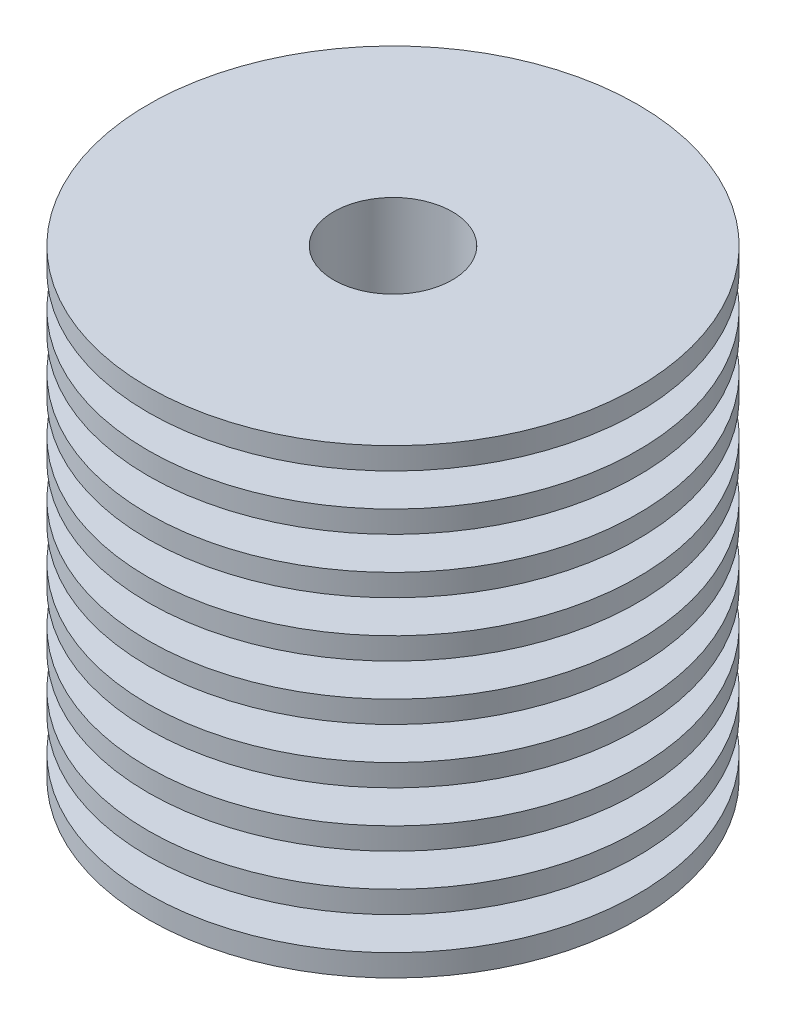
ISO-10303-21;
HEADER;
FILE_DESCRIPTION(('STEP AP214'),'2;1');
FILE_NAME('part.step','',(''),(''),'','','');
FILE_SCHEMA(('AUTOMOTIVE_DESIGN { 1 0 10303 214 1 1 1 1 }'));
ENDSEC;
DATA;
#1=APPLICATION_CONTEXT('core data for automotive mechanical design processes');
#2=APPLICATION_PROTOCOL_DEFINITION('international standard','automotive_design',2000,#1);
#3=PRODUCT_CONTEXT('',#1,'mechanical');
#4=PRODUCT('Part','Part','',(#3));
#5=PRODUCT_RELATED_PRODUCT_CATEGORY('part','',(#4));
#6=PRODUCT_DEFINITION_FORMATION('','',#4);
#7=PRODUCT_DEFINITION_CONTEXT('part definition',#1,'design');
#8=PRODUCT_DEFINITION('design','',#6,#7);
#9=PRODUCT_DEFINITION_SHAPE('','',#8);
#10=(LENGTH_UNIT() NAMED_UNIT(*) SI_UNIT(.MILLI.,.METRE.));
#11=(NAMED_UNIT(*) PLANE_ANGLE_UNIT() SI_UNIT($,.RADIAN.));
#12=(NAMED_UNIT(*) SI_UNIT($,.STERADIAN.) SOLID_ANGLE_UNIT());
#13=UNCERTAINTY_MEASURE_WITH_UNIT(LENGTH_MEASURE(1.E-05),#10,'distance_accuracy_value','');
#14=(GEOMETRIC_REPRESENTATION_CONTEXT(3) GLOBAL_UNCERTAINTY_ASSIGNED_CONTEXT((#13)) GLOBAL_UNIT_ASSIGNED_CONTEXT((#10,
#11,#12)) REPRESENTATION_CONTEXT('',''));
#15=CARTESIAN_POINT('',(0.,0.,0.));
#16=DIRECTION('',(0.,0.,1.));
#17=DIRECTION('',(1.,0.,0.));
#18=AXIS2_PLACEMENT_3D('',#15,#16,#17);
#19=CARTESIAN_POINT('',(0.,42.7,0.));
#20=DIRECTION('',(0.,-1.,0.));
#21=DIRECTION('',(0.,0.,-1.));
#22=AXIS2_PLACEMENT_3D('',#19,#20,#21);
#23=CYLINDRICAL_SURFACE('',#22,11.1500000000184);
#24=CARTESIAN_POINT('',(0.,18.5000000000241,0.));
#25=DIRECTION('',(0.,-1.,0.));
#26=DIRECTION('',(0.,0.,-1.));
#27=AXIS2_PLACEMENT_3D('',#24,#25,#26);
#28=CIRCLE('',#27,11.1500000000184);
#29=CARTESIAN_POINT('',(0.,18.5000000000241,-11.1500000000184));
#30=VERTEX_POINT('',#29);
#31=EDGE_CURVE('E10',#30,#30,#28,.T.);
#32=ORIENTED_EDGE('',*,*,#31,.T.);
#33=EDGE_LOOP('',(#32));
#34=FACE_BOUND('',#33,.T.);
#35=CARTESIAN_POINT('',(0.,17.5000000000241,0.));
#36=DIRECTION('',(0.,-1.,0.));
#37=DIRECTION('',(0.,0.,-1.));
#38=AXIS2_PLACEMENT_3D('',#35,#36,#37);
#39=CIRCLE('',#38,11.1500000000184);
#40=CARTESIAN_POINT('',(0.,17.5000000000241,-11.1500000000184));
#41=VERTEX_POINT('',#40);
#42=EDGE_CURVE('E143',#41,#41,#39,.T.);
#43=ORIENTED_EDGE('',*,*,#42,.F.);
#44=EDGE_LOOP('',(#43));
#45=FACE_BOUND('',#44,.T.);
#46=ADVANCED_FACE('F31',(#34,#45),#23,.T.);
#47=CARTESIAN_POINT('',(11.1500000000184,18.5000000000241,0.));
#48=DIRECTION('',(0.,1.,0.));
#49=DIRECTION('',(0.,0.,1.));
#50=AXIS2_PLACEMENT_3D('',#47,#48,#49);
#51=PLANE('',#50);
#52=CARTESIAN_POINT('',(0.,18.5000000000241,0.));
#53=DIRECTION('',(0.,-1.,0.));
#54=DIRECTION('',(0.,0.,-1.));
#55=AXIS2_PLACEMENT_3D('',#52,#53,#54);
#56=CIRCLE('',#55,5.0828638625652);
#57=CARTESIAN_POINT('',(0.,18.5000000000241,-5.0828638625652));
#58=VERTEX_POINT('',#57);
#59=EDGE_CURVE('E37',#58,#58,#56,.T.);
#60=ORIENTED_EDGE('',*,*,#59,.T.);
#61=EDGE_LOOP('',(#60));
#62=FACE_BOUND('',#61,.T.);
#63=ORIENTED_EDGE('',*,*,#31,.F.);
#64=EDGE_LOOP('',(#63));
#65=FACE_BOUND('',#64,.T.);
#66=ADVANCED_FACE('F177',(#62,#65),#51,.T.);
#67=CARTESIAN_POINT('',(0.,42.7,0.));
#68=DIRECTION('',(0.,-1.,0.));
#69=DIRECTION('',(0.,0.,-1.));
#70=AXIS2_PLACEMENT_3D('',#67,#68,#69);
#71=CYLINDRICAL_SURFACE('',#70,5.0828638625652);
#72=CARTESIAN_POINT('',(0.,20.0000000000241,0.));
#73=DIRECTION('',(0.,-1.,0.));
#74=DIRECTION('',(0.,0.,-1.));
#75=AXIS2_PLACEMENT_3D('',#72,#73,#74);
#76=CIRCLE('',#75,5.0828638625652);
#77=CARTESIAN_POINT('',(0.,20.0000000000241,-5.0828638625652));
#78=VERTEX_POINT('',#77);
#79=EDGE_CURVE('E41',#78,#78,#76,.T.);
#80=ORIENTED_EDGE('',*,*,#79,.T.);
#81=EDGE_LOOP('',(#80));
#82=FACE_BOUND('',#81,.T.);
#83=ORIENTED_EDGE('',*,*,#59,.F.);
#84=EDGE_LOOP('',(#83));
#85=FACE_BOUND('',#84,.T.);
#86=ADVANCED_FACE('F171',(#82,#85),#71,.T.);
#87=CARTESIAN_POINT('',(5.0828638625652,20.0000000000241,0.));
#88=DIRECTION('',(0.,-1.,0.));
#89=DIRECTION('',(0.,0.,-1.));
#90=AXIS2_PLACEMENT_3D('',#87,#88,#89);
#91=PLANE('',#90);
#92=CARTESIAN_POINT('',(0.,20.0000000000241,0.));
#93=DIRECTION('',(0.,-1.,0.));
#94=DIRECTION('',(0.,0.,-1.));
#95=AXIS2_PLACEMENT_3D('',#92,#93,#94);
#96=CIRCLE('',#95,11.1500000000184);
#97=CARTESIAN_POINT('',(0.,20.0000000000241,-11.1500000000184));
#98=VERTEX_POINT('',#97);
#99=EDGE_CURVE('E45',#98,#98,#96,.T.);
#100=ORIENTED_EDGE('',*,*,#99,.T.);
#101=EDGE_LOOP('',(#100));
#102=FACE_BOUND('',#101,.T.);
#103=ORIENTED_EDGE('',*,*,#79,.F.);
#104=EDGE_LOOP('',(#103));
#105=FACE_BOUND('',#104,.T.);
#106=ADVANCED_FACE('F165',(#102,#105),#91,.T.);
#107=CARTESIAN_POINT('',(0.,42.7,0.));
#108=DIRECTION('',(0.,-1.,0.));
#109=DIRECTION('',(0.,0.,-1.));
#110=AXIS2_PLACEMENT_3D('',#107,#108,#109);
#111=CYLINDRICAL_SURFACE('',#110,11.1500000000184);
#112=CARTESIAN_POINT('',(0.,21.0000000000241,0.));
#113=DIRECTION('',(0.,-1.,0.));
#114=DIRECTION('',(0.,0.,-1.));
#115=AXIS2_PLACEMENT_3D('',#112,#113,#114);
#116=CIRCLE('',#115,11.1500000000184);
#117=CARTESIAN_POINT('',(0.,21.0000000000241,-11.1500000000184));
#118=VERTEX_POINT('',#117);
#119=EDGE_CURVE('E50',#118,#118,#116,.T.);
#120=ORIENTED_EDGE('',*,*,#119,.T.);
#121=EDGE_LOOP('',(#120));
#122=FACE_BOUND('',#121,.T.);
#123=ORIENTED_EDGE('',*,*,#99,.F.);
#124=EDGE_LOOP('',(#123));
#125=FACE_BOUND('',#124,.T.);
#126=ADVANCED_FACE('F159',(#122,#125),#111,.T.);
#127=CARTESIAN_POINT('',(11.1500000000184,21.0000000000241,0.));
#128=DIRECTION('',(0.,1.,0.));
#129=DIRECTION('',(0.,0.,1.));
#130=AXIS2_PLACEMENT_3D('',#127,#128,#129);
#131=PLANE('',#130);
#132=CARTESIAN_POINT('',(0.,21.0000000000241,0.));
#133=DIRECTION('',(0.,1.,0.));
#134=DIRECTION('',(0.,0.,1.));
#135=AXIS2_PLACEMENT_3D('',#132,#133,#134);
#136=CIRCLE('',#135,2.7);
#137=CARTESIAN_POINT('',(0.,21.0000000000241,2.7));
#138=VERTEX_POINT('',#137);
#139=EDGE_CURVE('E146',#138,#138,#136,.T.);
#140=ORIENTED_EDGE('',*,*,#139,.F.);
#141=EDGE_LOOP('',(#140));
#142=FACE_BOUND('',#141,.T.);
#143=ORIENTED_EDGE('',*,*,#119,.F.);
#144=EDGE_LOOP('',(#143));
#145=FACE_BOUND('',#144,.T.);
#146=ADVANCED_FACE('F155',(#142,#145),#131,.T.);
#147=CARTESIAN_POINT('',(0.,14.7000000000059,0.));
#148=DIRECTION('',(0.,-1.,0.));
#149=DIRECTION('',(0.,0.,-1.));
#150=AXIS2_PLACEMENT_3D('',#147,#148,#149);
#151=CONICAL_SURFACE('',#150,2.10000000003666,0.785398163397448);
#152=CARTESIAN_POINT('',(0.,14.1000000000426,0.));
#153=DIRECTION('',(0.,-1.,0.));
#154=DIRECTION('',(0.,0.,-1.));
#155=AXIS2_PLACEMENT_3D('',#152,#153,#154);
#156=CIRCLE('',#155,2.7);
#157=CARTESIAN_POINT('',(0.,14.1000000000426,-2.7));
#158=VERTEX_POINT('',#157);
#159=EDGE_CURVE('E147',#158,#158,#156,.F.);
#160=ORIENTED_EDGE('',*,*,#159,.T.);
#161=EDGE_LOOP('',(#160));
#162=FACE_BOUND('',#161,.T.);
#163=CARTESIAN_POINT('',(0.,13.3000000000241,0.));
#164=DIRECTION('',(0.,-1.,0.));
#165=DIRECTION('',(0.,0.,-1.));
#166=AXIS2_PLACEMENT_3D('',#163,#164,#165);
#167=CIRCLE('',#166,3.50000000001843);
#168=CARTESIAN_POINT('',(0.,13.3000000000241,-3.50000000001843));
#169=VERTEX_POINT('',#168);
#170=EDGE_CURVE('E53',#169,#169,#167,.T.);
#171=ORIENTED_EDGE('',*,*,#170,.T.);
#172=EDGE_LOOP('',(#171));
#173=FACE_BOUND('',#172,.T.);
#174=ADVANCED_FACE('F158',(#162,#173),#151,.F.);
#175=CARTESIAN_POINT('',(0.,42.7,0.));
#176=DIRECTION('',(0.,-1.,0.));
#177=DIRECTION('',(0.,0.,-1.));
#178=AXIS2_PLACEMENT_3D('',#175,#176,#177);
#179=CYLINDRICAL_SURFACE('',#178,3.50000000001843);
#180=CARTESIAN_POINT('',(0.,2.41473507855972E-11,0.));
#181=DIRECTION('',(0.,-1.,0.));
#182=DIRECTION('',(0.,0.,-1.));
#183=AXIS2_PLACEMENT_3D('',#180,#181,#182);
#184=CIRCLE('',#183,3.50000000001843);
#185=CARTESIAN_POINT('',(0.,2.41473507855972E-11,-3.50000000001843));
#186=VERTEX_POINT('',#185);
#187=EDGE_CURVE('E56',#186,#186,#184,.T.);
#188=ORIENTED_EDGE('',*,*,#187,.T.);
#189=EDGE_LOOP('',(#188));
#190=FACE_BOUND('',#189,.T.);
#191=ORIENTED_EDGE('',*,*,#170,.F.);
#192=EDGE_LOOP('',(#191));
#193=FACE_BOUND('',#192,.T.);
#194=ADVANCED_FACE('F359',(#190,#193),#179,.F.);
#195=CARTESIAN_POINT('',(3.50000000001843,2.41478561405567E-11,0.));
#196=DIRECTION('',(0.,-1.,0.));
#197=DIRECTION('',(0.,0.,-1.));
#198=AXIS2_PLACEMENT_3D('',#195,#196,#197);
#199=PLANE('',#198);
#200=CARTESIAN_POINT('',(0.,2.41473507855972E-11,0.));
#201=DIRECTION('',(0.,-1.,0.));
#202=DIRECTION('',(0.,0.,-1.));
#203=AXIS2_PLACEMENT_3D('',#200,#201,#202);
#204=CIRCLE('',#203,11.1500000000184);
#205=CARTESIAN_POINT('',(0.,2.41473507855972E-11,-11.1500000000184));
#206=VERTEX_POINT('',#205);
#207=EDGE_CURVE('E59',#206,#206,#204,.T.);
#208=ORIENTED_EDGE('',*,*,#207,.T.);
#209=EDGE_LOOP('',(#208));
#210=FACE_BOUND('',#209,.T.);
#211=ORIENTED_EDGE('',*,*,#187,.F.);
#212=EDGE_LOOP('',(#211));
#213=FACE_BOUND('',#212,.T.);
#214=ADVANCED_FACE('F353',(#210,#213),#199,.T.);
#215=CARTESIAN_POINT('',(0.,42.7,0.));
#216=DIRECTION('',(0.,-1.,0.));
#217=DIRECTION('',(0.,0.,-1.));
#218=AXIS2_PLACEMENT_3D('',#215,#216,#217);
#219=CYLINDRICAL_SURFACE('',#218,11.1500000000184);
#220=CARTESIAN_POINT('',(0.,1.,0.));
#221=DIRECTION('',(0.,-1.,0.));
#222=DIRECTION('',(0.,0.,-1.));
#223=AXIS2_PLACEMENT_3D('',#220,#221,#222);
#224=CIRCLE('',#223,11.1500000000184);
#225=CARTESIAN_POINT('',(0.,1.,-11.1500000000184));
#226=VERTEX_POINT('',#225);
#227=EDGE_CURVE('E62',#226,#226,#224,.T.);
#228=ORIENTED_EDGE('',*,*,#227,.T.);
#229=EDGE_LOOP('',(#228));
#230=FACE_BOUND('',#229,.T.);
#231=ORIENTED_EDGE('',*,*,#207,.F.);
#232=EDGE_LOOP('',(#231));
#233=FACE_BOUND('',#232,.T.);
#234=ADVANCED_FACE('F347',(#230,#233),#219,.T.);
#235=CARTESIAN_POINT('',(11.1500000000184,1.,0.));
#236=DIRECTION('',(0.,1.,0.));
#237=DIRECTION('',(0.,0.,1.));
#238=AXIS2_PLACEMENT_3D('',#235,#236,#237);
#239=PLANE('',#238);
#240=CARTESIAN_POINT('',(0.,1.,0.));
#241=DIRECTION('',(0.,-1.,0.));
#242=DIRECTION('',(0.,0.,-1.));
#243=AXIS2_PLACEMENT_3D('',#240,#241,#242);
#244=CIRCLE('',#243,6.);
#245=CARTESIAN_POINT('',(0.,1.,-6.));
#246=VERTEX_POINT('',#245);
#247=EDGE_CURVE('E65',#246,#246,#244,.T.);
#248=ORIENTED_EDGE('',*,*,#247,.T.);
#249=EDGE_LOOP('',(#248));
#250=FACE_BOUND('',#249,.T.);
#251=ORIENTED_EDGE('',*,*,#227,.F.);
#252=EDGE_LOOP('',(#251));
#253=FACE_BOUND('',#252,.T.);
#254=ADVANCED_FACE('F341',(#250,#253),#239,.T.);
#255=CARTESIAN_POINT('',(0.,42.7,0.));
#256=DIRECTION('',(0.,-1.,0.));
#257=DIRECTION('',(0.,0.,-1.));
#258=AXIS2_PLACEMENT_3D('',#255,#256,#257);
#259=CYLINDRICAL_SURFACE('',#258,6.);
#260=CARTESIAN_POINT('',(0.,2.5,0.));
#261=DIRECTION('',(0.,-1.,0.));
#262=DIRECTION('',(0.,0.,-1.));
#263=AXIS2_PLACEMENT_3D('',#260,#261,#262);
#264=CIRCLE('',#263,6.);
#265=CARTESIAN_POINT('',(0.,2.5,-6.));
#266=VERTEX_POINT('',#265);
#267=EDGE_CURVE('E68',#266,#266,#264,.T.);
#268=ORIENTED_EDGE('',*,*,#267,.T.);
#269=EDGE_LOOP('',(#268));
#270=FACE_BOUND('',#269,.T.);
#271=ORIENTED_EDGE('',*,*,#247,.F.);
#272=EDGE_LOOP('',(#271));
#273=FACE_BOUND('',#272,.T.);
#274=ADVANCED_FACE('F335',(#270,#273),#259,.T.);
#275=CARTESIAN_POINT('',(6.,2.5,0.));
#276=DIRECTION('',(0.,-1.,0.));
#277=DIRECTION('',(0.,0.,-1.));
#278=AXIS2_PLACEMENT_3D('',#275,#276,#277);
#279=PLANE('',#278);
#280=CARTESIAN_POINT('',(0.,2.5,0.));
#281=DIRECTION('',(0.,-1.,0.));
#282=DIRECTION('',(0.,0.,-1.));
#283=AXIS2_PLACEMENT_3D('',#280,#281,#282);
#284=CIRCLE('',#283,11.1500000000184);
#285=CARTESIAN_POINT('',(0.,2.5,-11.1500000000184));
#286=VERTEX_POINT('',#285);
#287=EDGE_CURVE('E71',#286,#286,#284,.T.);
#288=ORIENTED_EDGE('',*,*,#287,.T.);
#289=EDGE_LOOP('',(#288));
#290=FACE_BOUND('',#289,.T.);
#291=ORIENTED_EDGE('',*,*,#267,.F.);
#292=EDGE_LOOP('',(#291));
#293=FACE_BOUND('',#292,.T.);
#294=ADVANCED_FACE('F329',(#290,#293),#279,.T.);
#295=CARTESIAN_POINT('',(0.,42.7,0.));
#296=DIRECTION('',(0.,-1.,0.));
#297=DIRECTION('',(0.,0.,-1.));
#298=AXIS2_PLACEMENT_3D('',#295,#296,#297);
#299=CYLINDRICAL_SURFACE('',#298,11.1500000000184);
#300=CARTESIAN_POINT('',(0.,3.50000000002414,0.));
#301=DIRECTION('',(0.,-1.,0.));
#302=DIRECTION('',(0.,0.,-1.));
#303=AXIS2_PLACEMENT_3D('',#300,#301,#302);
#304=CIRCLE('',#303,11.1500000000184);
#305=CARTESIAN_POINT('',(0.,3.50000000002414,-11.1500000000184));
#306=VERTEX_POINT('',#305);
#307=EDGE_CURVE('E74',#306,#306,#304,.T.);
#308=ORIENTED_EDGE('',*,*,#307,.T.);
#309=EDGE_LOOP('',(#308));
#310=FACE_BOUND('',#309,.T.);
#311=ORIENTED_EDGE('',*,*,#287,.F.);
#312=EDGE_LOOP('',(#311));
#313=FACE_BOUND('',#312,.T.);
#314=ADVANCED_FACE('F323',(#310,#313),#299,.T.);
#315=CARTESIAN_POINT('',(11.1500000000184,3.50000000002415,0.));
#316=DIRECTION('',(0.,1.,0.));
#317=DIRECTION('',(0.,0.,1.));
#318=AXIS2_PLACEMENT_3D('',#315,#316,#317);
#319=PLANE('',#318);
#320=CARTESIAN_POINT('',(0.,3.50000000002414,0.));
#321=DIRECTION('',(0.,-1.,0.));
#322=DIRECTION('',(0.,0.,-1.));
#323=AXIS2_PLACEMENT_3D('',#320,#321,#322);
#324=CIRCLE('',#323,5.86898055181083);
#325=CARTESIAN_POINT('',(0.,3.50000000002414,-5.86898055181083));
#326=VERTEX_POINT('',#325);
#327=EDGE_CURVE('E77',#326,#326,#324,.T.);
#328=ORIENTED_EDGE('',*,*,#327,.T.);
#329=EDGE_LOOP('',(#328));
#330=FACE_BOUND('',#329,.T.);
#331=ORIENTED_EDGE('',*,*,#307,.F.);
#332=EDGE_LOOP('',(#331));
#333=FACE_BOUND('',#332,.T.);
#334=ADVANCED_FACE('F317',(#330,#333),#319,.T.);
#335=CARTESIAN_POINT('',(0.,42.7,0.));
#336=DIRECTION('',(0.,-1.,0.));
#337=DIRECTION('',(0.,0.,-1.));
#338=AXIS2_PLACEMENT_3D('',#335,#336,#337);
#339=CYLINDRICAL_SURFACE('',#338,5.86898055181083);
#340=CARTESIAN_POINT('',(0.,5.00000000002415,0.));
#341=DIRECTION('',(0.,-1.,0.));
#342=DIRECTION('',(0.,0.,-1.));
#343=AXIS2_PLACEMENT_3D('',#340,#341,#342);
#344=CIRCLE('',#343,5.86898055181083);
#345=CARTESIAN_POINT('',(0.,5.00000000002415,-5.86898055181083));
#346=VERTEX_POINT('',#345);
#347=EDGE_CURVE('E80',#346,#346,#344,.T.);
#348=ORIENTED_EDGE('',*,*,#347,.T.);
#349=EDGE_LOOP('',(#348));
#350=FACE_BOUND('',#349,.T.);
#351=ORIENTED_EDGE('',*,*,#327,.F.);
#352=EDGE_LOOP('',(#351));
#353=FACE_BOUND('',#352,.T.);
#354=ADVANCED_FACE('F311',(#350,#353),#339,.T.);
#355=CARTESIAN_POINT('',(5.86898055181083,5.00000000002415,0.));
#356=DIRECTION('',(0.,-1.,0.));
#357=DIRECTION('',(0.,0.,-1.));
#358=AXIS2_PLACEMENT_3D('',#355,#356,#357);
#359=PLANE('',#358);
#360=CARTESIAN_POINT('',(0.,5.00000000002415,0.));
#361=DIRECTION('',(0.,-1.,0.));
#362=DIRECTION('',(0.,0.,-1.));
#363=AXIS2_PLACEMENT_3D('',#360,#361,#362);
#364=CIRCLE('',#363,11.1500000000184);
#365=CARTESIAN_POINT('',(0.,5.00000000002415,-11.1500000000184));
#366=VERTEX_POINT('',#365);
#367=EDGE_CURVE('E83',#366,#366,#364,.T.);
#368=ORIENTED_EDGE('',*,*,#367,.T.);
#369=EDGE_LOOP('',(#368));
#370=FACE_BOUND('',#369,.T.);
#371=ORIENTED_EDGE('',*,*,#347,.F.);
#372=EDGE_LOOP('',(#371));
#373=FACE_BOUND('',#372,.T.);
#374=ADVANCED_FACE('F305',(#370,#373),#359,.T.);
#375=CARTESIAN_POINT('',(0.,42.7,0.));
#376=DIRECTION('',(0.,-1.,0.));
#377=DIRECTION('',(0.,0.,-1.));
#378=AXIS2_PLACEMENT_3D('',#375,#376,#377);
#379=CYLINDRICAL_SURFACE('',#378,11.1500000000184);
#380=CARTESIAN_POINT('',(0.,6.00000000002415,0.));
#381=DIRECTION('',(0.,-1.,0.));
#382=DIRECTION('',(0.,0.,-1.));
#383=AXIS2_PLACEMENT_3D('',#380,#381,#382);
#384=CIRCLE('',#383,11.1500000000184);
#385=CARTESIAN_POINT('',(0.,6.00000000002415,-11.1500000000184));
#386=VERTEX_POINT('',#385);
#387=EDGE_CURVE('E86',#386,#386,#384,.T.);
#388=ORIENTED_EDGE('',*,*,#387,.T.);
#389=EDGE_LOOP('',(#388));
#390=FACE_BOUND('',#389,.T.);
#391=ORIENTED_EDGE('',*,*,#367,.F.);
#392=EDGE_LOOP('',(#391));
#393=FACE_BOUND('',#392,.T.);
#394=ADVANCED_FACE('F299',(#390,#393),#379,.T.);
#395=CARTESIAN_POINT('',(11.1500000000184,6.00000000002415,0.));
#396=DIRECTION('',(0.,1.,0.));
#397=DIRECTION('',(0.,0.,1.));
#398=AXIS2_PLACEMENT_3D('',#395,#396,#397);
#399=PLANE('',#398);
#400=CARTESIAN_POINT('',(0.,6.00000000002415,0.));
#401=DIRECTION('',(0.,-1.,0.));
#402=DIRECTION('',(0.,0.,-1.));
#403=AXIS2_PLACEMENT_3D('',#400,#401,#402);
#404=CIRCLE('',#403,5.73796110360322);
#405=CARTESIAN_POINT('',(0.,6.00000000002415,-5.73796110360322));
#406=VERTEX_POINT('',#405);
#407=EDGE_CURVE('E89',#406,#406,#404,.T.);
#408=ORIENTED_EDGE('',*,*,#407,.T.);
#409=EDGE_LOOP('',(#408));
#410=FACE_BOUND('',#409,.T.);
#411=ORIENTED_EDGE('',*,*,#387,.F.);
#412=EDGE_LOOP('',(#411));
#413=FACE_BOUND('',#412,.T.);
#414=ADVANCED_FACE('F293',(#410,#413),#399,.T.);
#415=CARTESIAN_POINT('',(0.,42.7,0.));
#416=DIRECTION('',(0.,-1.,0.));
#417=DIRECTION('',(0.,0.,-1.));
#418=AXIS2_PLACEMENT_3D('',#415,#416,#417);
#419=CYLINDRICAL_SURFACE('',#418,5.73796110360322);
#420=CARTESIAN_POINT('',(0.,7.50000000002415,0.));
#421=DIRECTION('',(0.,-1.,0.));
#422=DIRECTION('',(0.,0.,-1.));
#423=AXIS2_PLACEMENT_3D('',#420,#421,#422);
#424=CIRCLE('',#423,5.73796110360322);
#425=CARTESIAN_POINT('',(0.,7.50000000002415,-5.73796110360322));
#426=VERTEX_POINT('',#425);
#427=EDGE_CURVE('E92',#426,#426,#424,.T.);
#428=ORIENTED_EDGE('',*,*,#427,.T.);
#429=EDGE_LOOP('',(#428));
#430=FACE_BOUND('',#429,.T.);
#431=ORIENTED_EDGE('',*,*,#407,.F.);
#432=EDGE_LOOP('',(#431));
#433=FACE_BOUND('',#432,.T.);
#434=ADVANCED_FACE('F287',(#430,#433),#419,.T.);
#435=CARTESIAN_POINT('',(5.73796110360322,7.50000000002415,0.));
#436=DIRECTION('',(0.,-1.,0.));
#437=DIRECTION('',(0.,0.,-1.));
#438=AXIS2_PLACEMENT_3D('',#435,#436,#437);
#439=PLANE('',#438);
#440=CARTESIAN_POINT('',(0.,7.50000000002415,0.));
#441=DIRECTION('',(0.,-1.,0.));
#442=DIRECTION('',(0.,0.,-1.));
#443=AXIS2_PLACEMENT_3D('',#440,#441,#442);
#444=CIRCLE('',#443,11.1500000000184);
#445=CARTESIAN_POINT('',(0.,7.50000000002415,-11.1500000000184));
#446=VERTEX_POINT('',#445);
#447=EDGE_CURVE('E95',#446,#446,#444,.T.);
#448=ORIENTED_EDGE('',*,*,#447,.T.);
#449=EDGE_LOOP('',(#448));
#450=FACE_BOUND('',#449,.T.);
#451=ORIENTED_EDGE('',*,*,#427,.F.);
#452=EDGE_LOOP('',(#451));
#453=FACE_BOUND('',#452,.T.);
#454=ADVANCED_FACE('F281',(#450,#453),#439,.T.);
#455=CARTESIAN_POINT('',(0.,42.7,0.));
#456=DIRECTION('',(0.,-1.,0.));
#457=DIRECTION('',(0.,0.,-1.));
#458=AXIS2_PLACEMENT_3D('',#455,#456,#457);
#459=CYLINDRICAL_SURFACE('',#458,11.1500000000184);
#460=CARTESIAN_POINT('',(0.,8.50000000002415,0.));
#461=DIRECTION('',(0.,-1.,0.));
#462=DIRECTION('',(0.,0.,-1.));
#463=AXIS2_PLACEMENT_3D('',#460,#461,#462);
#464=CIRCLE('',#463,11.1500000000184);
#465=CARTESIAN_POINT('',(0.,8.50000000002415,-11.1500000000184));
#466=VERTEX_POINT('',#465);
#467=EDGE_CURVE('E98',#466,#466,#464,.T.);
#468=ORIENTED_EDGE('',*,*,#467,.T.);
#469=EDGE_LOOP('',(#468));
#470=FACE_BOUND('',#469,.T.);
#471=ORIENTED_EDGE('',*,*,#447,.F.);
#472=EDGE_LOOP('',(#471));
#473=FACE_BOUND('',#472,.T.);
#474=ADVANCED_FACE('F275',(#470,#473),#459,.T.);
#475=CARTESIAN_POINT('',(11.1500000000184,8.50000000002414,0.));
#476=DIRECTION('',(0.,1.,0.));
#477=DIRECTION('',(0.,0.,1.));
#478=AXIS2_PLACEMENT_3D('',#475,#476,#477);
#479=PLANE('',#478);
#480=CARTESIAN_POINT('',(0.,8.50000000002415,0.));
#481=DIRECTION('',(0.,-1.,0.));
#482=DIRECTION('',(0.,0.,-1.));
#483=AXIS2_PLACEMENT_3D('',#480,#481,#482);
#484=CIRCLE('',#483,5.60694165539562);
#485=CARTESIAN_POINT('',(0.,8.50000000002415,-5.60694165539562));
#486=VERTEX_POINT('',#485);
#487=EDGE_CURVE('E101',#486,#486,#484,.T.);
#488=ORIENTED_EDGE('',*,*,#487,.T.);
#489=EDGE_LOOP('',(#488));
#490=FACE_BOUND('',#489,.T.);
#491=ORIENTED_EDGE('',*,*,#467,.F.);
#492=EDGE_LOOP('',(#491));
#493=FACE_BOUND('',#492,.T.);
#494=ADVANCED_FACE('F269',(#490,#493),#479,.T.);
#495=CARTESIAN_POINT('',(0.,42.7,0.));
#496=DIRECTION('',(0.,-1.,0.));
#497=DIRECTION('',(0.,0.,-1.));
#498=AXIS2_PLACEMENT_3D('',#495,#496,#497);
#499=CYLINDRICAL_SURFACE('',#498,5.60694165539562);
#500=CARTESIAN_POINT('',(0.,10.0000000000241,0.));
#501=DIRECTION('',(0.,-1.,0.));
#502=DIRECTION('',(0.,0.,-1.));
#503=AXIS2_PLACEMENT_3D('',#500,#501,#502);
#504=CIRCLE('',#503,5.60694165539562);
#505=CARTESIAN_POINT('',(0.,10.0000000000241,-5.60694165539562));
#506=VERTEX_POINT('',#505);
#507=EDGE_CURVE('E104',#506,#506,#504,.T.);
#508=ORIENTED_EDGE('',*,*,#507,.T.);
#509=EDGE_LOOP('',(#508));
#510=FACE_BOUND('',#509,.T.);
#511=ORIENTED_EDGE('',*,*,#487,.F.);
#512=EDGE_LOOP('',(#511));
#513=FACE_BOUND('',#512,.T.);
#514=ADVANCED_FACE('F263',(#510,#513),#499,.T.);
#515=CARTESIAN_POINT('',(5.60694165539562,10.0000000000241,0.));
#516=DIRECTION('',(0.,-1.,0.));
#517=DIRECTION('',(0.,0.,-1.));
#518=AXIS2_PLACEMENT_3D('',#515,#516,#517);
#519=PLANE('',#518);
#520=CARTESIAN_POINT('',(0.,10.0000000000241,0.));
#521=DIRECTION('',(0.,-1.,0.));
#522=DIRECTION('',(0.,0.,-1.));
#523=AXIS2_PLACEMENT_3D('',#520,#521,#522);
#524=CIRCLE('',#523,11.1500000000184);
#525=CARTESIAN_POINT('',(0.,10.0000000000241,-11.1500000000184));
#526=VERTEX_POINT('',#525);
#527=EDGE_CURVE('E107',#526,#526,#524,.T.);
#528=ORIENTED_EDGE('',*,*,#527,.T.);
#529=EDGE_LOOP('',(#528));
#530=FACE_BOUND('',#529,.T.);
#531=ORIENTED_EDGE('',*,*,#507,.F.);
#532=EDGE_LOOP('',(#531));
#533=FACE_BOUND('',#532,.T.);
#534=ADVANCED_FACE('F257',(#530,#533),#519,.T.);
#535=CARTESIAN_POINT('',(0.,42.7,0.));
#536=DIRECTION('',(0.,-1.,0.));
#537=DIRECTION('',(0.,0.,-1.));
#538=AXIS2_PLACEMENT_3D('',#535,#536,#537);
#539=CYLINDRICAL_SURFACE('',#538,11.1500000000184);
#540=CARTESIAN_POINT('',(0.,11.0000000000241,0.));
#541=DIRECTION('',(0.,-1.,0.));
#542=DIRECTION('',(0.,0.,-1.));
#543=AXIS2_PLACEMENT_3D('',#540,#541,#542);
#544=CIRCLE('',#543,11.1500000000184);
#545=CARTESIAN_POINT('',(0.,11.0000000000241,-11.1500000000184));
#546=VERTEX_POINT('',#545);
#547=EDGE_CURVE('E110',#546,#546,#544,.T.);
#548=ORIENTED_EDGE('',*,*,#547,.T.);
#549=EDGE_LOOP('',(#548));
#550=FACE_BOUND('',#549,.T.);
#551=ORIENTED_EDGE('',*,*,#527,.F.);
#552=EDGE_LOOP('',(#551));
#553=FACE_BOUND('',#552,.T.);
#554=ADVANCED_FACE('F251',(#550,#553),#539,.T.);
#555=CARTESIAN_POINT('',(11.1500000000184,11.0000000000241,0.));
#556=DIRECTION('',(0.,1.,0.));
#557=DIRECTION('',(0.,0.,1.));
#558=AXIS2_PLACEMENT_3D('',#555,#556,#557);
#559=PLANE('',#558);
#560=CARTESIAN_POINT('',(0.,11.0000000000241,0.));
#561=DIRECTION('',(0.,-1.,0.));
#562=DIRECTION('',(0.,0.,-1.));
#563=AXIS2_PLACEMENT_3D('',#560,#561,#562);
#564=CIRCLE('',#563,5.47592220718801);
#565=CARTESIAN_POINT('',(0.,11.0000000000241,-5.47592220718801));
#566=VERTEX_POINT('',#565);
#567=EDGE_CURVE('E113',#566,#566,#564,.T.);
#568=ORIENTED_EDGE('',*,*,#567,.T.);
#569=EDGE_LOOP('',(#568));
#570=FACE_BOUND('',#569,.T.);
#571=ORIENTED_EDGE('',*,*,#547,.F.);
#572=EDGE_LOOP('',(#571));
#573=FACE_BOUND('',#572,.T.);
#574=ADVANCED_FACE('F245',(#570,#573),#559,.T.);
#575=CARTESIAN_POINT('',(0.,42.7,0.));
#576=DIRECTION('',(0.,-1.,0.));
#577=DIRECTION('',(0.,0.,-1.));
#578=AXIS2_PLACEMENT_3D('',#575,#576,#577);
#579=CYLINDRICAL_SURFACE('',#578,5.47592220718801);
#580=CARTESIAN_POINT('',(0.,12.5000000000241,0.));
#581=DIRECTION('',(0.,-1.,0.));
#582=DIRECTION('',(0.,0.,-1.));
#583=AXIS2_PLACEMENT_3D('',#580,#581,#582);
#584=CIRCLE('',#583,5.47592220718801);
#585=CARTESIAN_POINT('',(0.,12.5000000000241,-5.47592220718801));
#586=VERTEX_POINT('',#585);
#587=EDGE_CURVE('E116',#586,#586,#584,.T.);
#588=ORIENTED_EDGE('',*,*,#587,.T.);
#589=EDGE_LOOP('',(#588));
#590=FACE_BOUND('',#589,.T.);
#591=ORIENTED_EDGE('',*,*,#567,.F.);
#592=EDGE_LOOP('',(#591));
#593=FACE_BOUND('',#592,.T.);
#594=ADVANCED_FACE('F239',(#590,#593),#579,.T.);
#595=CARTESIAN_POINT('',(5.47592220718801,12.5000000000241,0.));
#596=DIRECTION('',(0.,-1.,0.));
#597=DIRECTION('',(0.,0.,-1.));
#598=AXIS2_PLACEMENT_3D('',#595,#596,#597);
#599=PLANE('',#598);
#600=CARTESIAN_POINT('',(0.,12.5000000000241,0.));
#601=DIRECTION('',(0.,-1.,0.));
#602=DIRECTION('',(0.,0.,-1.));
#603=AXIS2_PLACEMENT_3D('',#600,#601,#602);
#604=CIRCLE('',#603,11.1500000000184);
#605=CARTESIAN_POINT('',(0.,12.5000000000241,-11.1500000000184));
#606=VERTEX_POINT('',#605);
#607=EDGE_CURVE('E119',#606,#606,#604,.T.);
#608=ORIENTED_EDGE('',*,*,#607,.T.);
#609=EDGE_LOOP('',(#608));
#610=FACE_BOUND('',#609,.T.);
#611=ORIENTED_EDGE('',*,*,#587,.F.);
#612=EDGE_LOOP('',(#611));
#613=FACE_BOUND('',#612,.T.);
#614=ADVANCED_FACE('F233',(#610,#613),#599,.T.);
#615=CARTESIAN_POINT('',(0.,42.7,0.));
#616=DIRECTION('',(0.,-1.,0.));
#617=DIRECTION('',(0.,0.,-1.));
#618=AXIS2_PLACEMENT_3D('',#615,#616,#617);
#619=CYLINDRICAL_SURFACE('',#618,11.1500000000184);
#620=CARTESIAN_POINT('',(0.,13.5000000000241,0.));
#621=DIRECTION('',(0.,-1.,0.));
#622=DIRECTION('',(0.,0.,-1.));
#623=AXIS2_PLACEMENT_3D('',#620,#621,#622);
#624=CIRCLE('',#623,11.1500000000184);
#625=CARTESIAN_POINT('',(0.,13.5000000000241,-11.1500000000184));
#626=VERTEX_POINT('',#625);
#627=EDGE_CURVE('E122',#626,#626,#624,.T.);
#628=ORIENTED_EDGE('',*,*,#627,.T.);
#629=EDGE_LOOP('',(#628));
#630=FACE_BOUND('',#629,.T.);
#631=ORIENTED_EDGE('',*,*,#607,.F.);
#632=EDGE_LOOP('',(#631));
#633=FACE_BOUND('',#632,.T.);
#634=ADVANCED_FACE('F227',(#630,#633),#619,.T.);
#635=CARTESIAN_POINT('',(11.1500000000184,13.5000000000241,0.));
#636=DIRECTION('',(0.,1.,0.));
#637=DIRECTION('',(0.,0.,1.));
#638=AXIS2_PLACEMENT_3D('',#635,#636,#637);
#639=PLANE('',#638);
#640=CARTESIAN_POINT('',(0.,13.5000000000241,0.));
#641=DIRECTION('',(0.,-1.,0.));
#642=DIRECTION('',(0.,0.,-1.));
#643=AXIS2_PLACEMENT_3D('',#640,#641,#642);
#644=CIRCLE('',#643,5.34490275898041);
#645=CARTESIAN_POINT('',(0.,13.5000000000241,-5.34490275898041));
#646=VERTEX_POINT('',#645);
#647=EDGE_CURVE('E125',#646,#646,#644,.T.);
#648=ORIENTED_EDGE('',*,*,#647,.T.);
#649=EDGE_LOOP('',(#648));
#650=FACE_BOUND('',#649,.T.);
#651=ORIENTED_EDGE('',*,*,#627,.F.);
#652=EDGE_LOOP('',(#651));
#653=FACE_BOUND('',#652,.T.);
#654=ADVANCED_FACE('F221',(#650,#653),#639,.T.);
#655=CARTESIAN_POINT('',(0.,42.7,0.));
#656=DIRECTION('',(0.,-1.,0.));
#657=DIRECTION('',(0.,0.,-1.));
#658=AXIS2_PLACEMENT_3D('',#655,#656,#657);
#659=CYLINDRICAL_SURFACE('',#658,5.34490275898041);
#660=CARTESIAN_POINT('',(0.,15.0000000000241,0.));
#661=DIRECTION('',(0.,-1.,0.));
#662=DIRECTION('',(0.,0.,-1.));
#663=AXIS2_PLACEMENT_3D('',#660,#661,#662);
#664=CIRCLE('',#663,5.34490275898041);
#665=CARTESIAN_POINT('',(0.,15.0000000000241,-5.34490275898041));
#666=VERTEX_POINT('',#665);
#667=EDGE_CURVE('E128',#666,#666,#664,.T.);
#668=ORIENTED_EDGE('',*,*,#667,.T.);
#669=EDGE_LOOP('',(#668));
#670=FACE_BOUND('',#669,.T.);
#671=ORIENTED_EDGE('',*,*,#647,.F.);
#672=EDGE_LOOP('',(#671));
#673=FACE_BOUND('',#672,.T.);
#674=ADVANCED_FACE('F215',(#670,#673),#659,.T.);
#675=CARTESIAN_POINT('',(5.34490275898041,15.0000000000241,0.));
#676=DIRECTION('',(0.,-1.,0.));
#677=DIRECTION('',(0.,0.,-1.));
#678=AXIS2_PLACEMENT_3D('',#675,#676,#677);
#679=PLANE('',#678);
#680=CARTESIAN_POINT('',(0.,15.0000000000241,0.));
#681=DIRECTION('',(0.,-1.,0.));
#682=DIRECTION('',(0.,0.,-1.));
#683=AXIS2_PLACEMENT_3D('',#680,#681,#682);
#684=CIRCLE('',#683,11.1500000000184);
#685=CARTESIAN_POINT('',(0.,15.0000000000241,-11.1500000000184));
#686=VERTEX_POINT('',#685);
#687=EDGE_CURVE('E131',#686,#686,#684,.T.);
#688=ORIENTED_EDGE('',*,*,#687,.T.);
#689=EDGE_LOOP('',(#688));
#690=FACE_BOUND('',#689,.T.);
#691=ORIENTED_EDGE('',*,*,#667,.F.);
#692=EDGE_LOOP('',(#691));
#693=FACE_BOUND('',#692,.T.);
#694=ADVANCED_FACE('F209',(#690,#693),#679,.T.);
#695=CARTESIAN_POINT('',(0.,42.7,0.));
#696=DIRECTION('',(0.,-1.,0.));
#697=DIRECTION('',(0.,0.,-1.));
#698=AXIS2_PLACEMENT_3D('',#695,#696,#697);
#699=CYLINDRICAL_SURFACE('',#698,11.1500000000184);
#700=CARTESIAN_POINT('',(0.,16.0000000000241,0.));
#701=DIRECTION('',(0.,-1.,0.));
#702=DIRECTION('',(0.,0.,-1.));
#703=AXIS2_PLACEMENT_3D('',#700,#701,#702);
#704=CIRCLE('',#703,11.1500000000184);
#705=CARTESIAN_POINT('',(0.,16.0000000000241,-11.1500000000184));
#706=VERTEX_POINT('',#705);
#707=EDGE_CURVE('E134',#706,#706,#704,.T.);
#708=ORIENTED_EDGE('',*,*,#707,.T.);
#709=EDGE_LOOP('',(#708));
#710=FACE_BOUND('',#709,.T.);
#711=ORIENTED_EDGE('',*,*,#687,.F.);
#712=EDGE_LOOP('',(#711));
#713=FACE_BOUND('',#712,.T.);
#714=ADVANCED_FACE('F203',(#710,#713),#699,.T.);
#715=CARTESIAN_POINT('',(11.1500000000184,16.0000000000241,0.));
#716=DIRECTION('',(0.,1.,0.));
#717=DIRECTION('',(0.,0.,1.));
#718=AXIS2_PLACEMENT_3D('',#715,#716,#717);
#719=PLANE('',#718);
#720=CARTESIAN_POINT('',(0.,16.0000000000241,0.));
#721=DIRECTION('',(0.,-1.,0.));
#722=DIRECTION('',(0.,0.,-1.));
#723=AXIS2_PLACEMENT_3D('',#720,#721,#722);
#724=CIRCLE('',#723,5.21388331077281);
#725=CARTESIAN_POINT('',(0.,16.0000000000241,-5.21388331077281));
#726=VERTEX_POINT('',#725);
#727=EDGE_CURVE('E137',#726,#726,#724,.T.);
#728=ORIENTED_EDGE('',*,*,#727,.T.);
#729=EDGE_LOOP('',(#728));
#730=FACE_BOUND('',#729,.T.);
#731=ORIENTED_EDGE('',*,*,#707,.F.);
#732=EDGE_LOOP('',(#731));
#733=FACE_BOUND('',#732,.T.);
#734=ADVANCED_FACE('F197',(#730,#733),#719,.T.);
#735=CARTESIAN_POINT('',(0.,42.7,0.));
#736=DIRECTION('',(0.,-1.,0.));
#737=DIRECTION('',(0.,0.,-1.));
#738=AXIS2_PLACEMENT_3D('',#735,#736,#737);
#739=CYLINDRICAL_SURFACE('',#738,5.21388331077281);
#740=CARTESIAN_POINT('',(0.,17.5000000000241,0.));
#741=DIRECTION('',(0.,-1.,0.));
#742=DIRECTION('',(0.,0.,-1.));
#743=AXIS2_PLACEMENT_3D('',#740,#741,#742);
#744=CIRCLE('',#743,5.21388331077281);
#745=CARTESIAN_POINT('',(0.,17.5000000000241,-5.21388331077281));
#746=VERTEX_POINT('',#745);
#747=EDGE_CURVE('E140',#746,#746,#744,.T.);
#748=ORIENTED_EDGE('',*,*,#747,.T.);
#749=EDGE_LOOP('',(#748));
#750=FACE_BOUND('',#749,.T.);
#751=ORIENTED_EDGE('',*,*,#727,.F.);
#752=EDGE_LOOP('',(#751));
#753=FACE_BOUND('',#752,.T.);
#754=ADVANCED_FACE('F191',(#750,#753),#739,.T.);
#755=CARTESIAN_POINT('',(5.21388331077281,17.5000000000241,0.));
#756=DIRECTION('',(0.,-1.,0.));
#757=DIRECTION('',(0.,0.,-1.));
#758=AXIS2_PLACEMENT_3D('',#755,#756,#757);
#759=PLANE('',#758);
#760=ORIENTED_EDGE('',*,*,#42,.T.);
#761=EDGE_LOOP('',(#760));
#762=FACE_BOUND('',#761,.T.);
#763=ORIENTED_EDGE('',*,*,#747,.F.);
#764=EDGE_LOOP('',(#763));
#765=FACE_BOUND('',#764,.T.);
#766=ADVANCED_FACE('F188',(#762,#765),#759,.T.);
#767=CARTESIAN_POINT('',(0.,-0.000999999975853649,0.));
#768=DIRECTION('',(0.,1.,0.));
#769=DIRECTION('',(0.,0.,1.));
#770=AXIS2_PLACEMENT_3D('',#767,#768,#769);
#771=CYLINDRICAL_SURFACE('',#770,2.7);
#772=ORIENTED_EDGE('',*,*,#159,.F.);
#773=EDGE_LOOP('',(#772));
#774=FACE_BOUND('',#773,.T.);
#775=ORIENTED_EDGE('',*,*,#139,.T.);
#776=EDGE_LOOP('',(#775));
#777=FACE_BOUND('',#776,.T.);
#778=ADVANCED_FACE('F153',(#774,#777),#771,.F.);
#779=CLOSED_SHELL('',(#46,#66,#86,#106,#126,#146,#174,#194,#214,#234,#254,#274,#294,#314,#334,
#354,#374,#394,#414,#434,#454,#474,#494,#514,#534,#554,#574,#594,#614,#634,#654,#674,#694,#714,
#734,#754,#766,#778));
#780=MANIFOLD_SOLID_BREP('B2',#779);
#781=ADVANCED_BREP_SHAPE_REPRESENTATION('',(#18,#780),#14);
#782=SHAPE_DEFINITION_REPRESENTATION(#9,#781);
ENDSEC;
END-ISO-10303-21;
